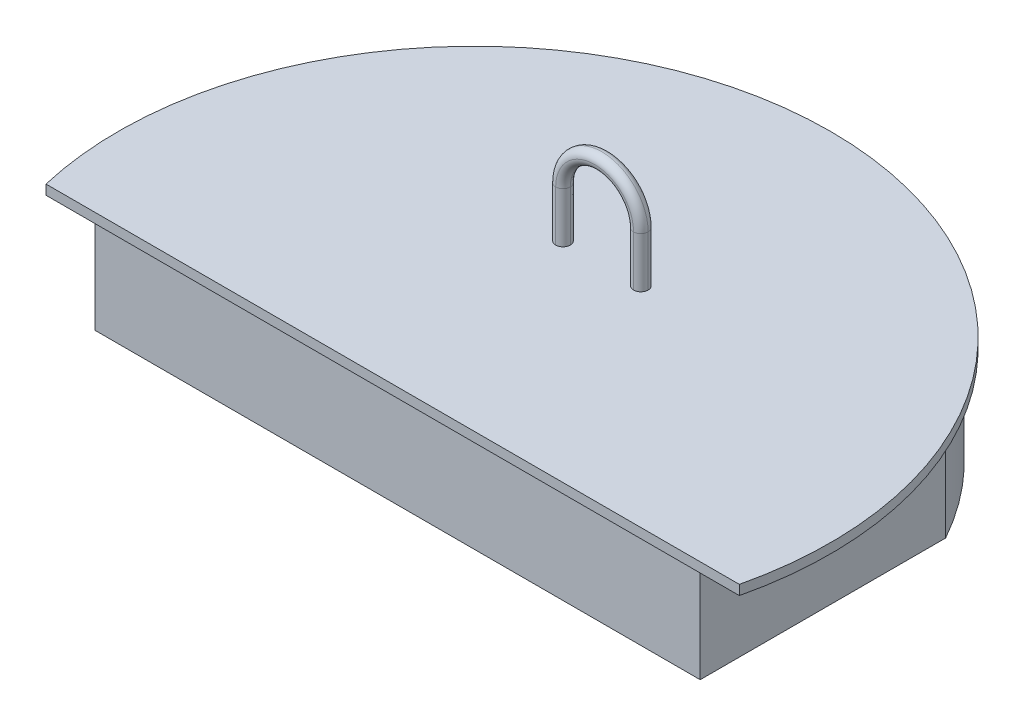
ISO-10303-21;
HEADER;
FILE_DESCRIPTION(('STEP AP214'),'2;1');
FILE_NAME('part.step','',(''),(''),'','','');
FILE_SCHEMA(('AUTOMOTIVE_DESIGN { 1 0 10303 214 1 1 1 1 }'));
ENDSEC;
DATA;
#1=APPLICATION_CONTEXT('core data for automotive mechanical design processes');
#2=APPLICATION_PROTOCOL_DEFINITION('international standard','automotive_design',2000,#1);
#3=PRODUCT_CONTEXT('',#1,'mechanical');
#4=PRODUCT('Part','Part','',(#3));
#5=PRODUCT_RELATED_PRODUCT_CATEGORY('part','',(#4));
#6=PRODUCT_DEFINITION_FORMATION('','',#4);
#7=PRODUCT_DEFINITION_CONTEXT('part definition',#1,'design');
#8=PRODUCT_DEFINITION('design','',#6,#7);
#9=PRODUCT_DEFINITION_SHAPE('','',#8);
#10=(LENGTH_UNIT() NAMED_UNIT(*) SI_UNIT(.MILLI.,.METRE.));
#11=(NAMED_UNIT(*) PLANE_ANGLE_UNIT() SI_UNIT($,.RADIAN.));
#12=(NAMED_UNIT(*) SI_UNIT($,.STERADIAN.) SOLID_ANGLE_UNIT());
#13=UNCERTAINTY_MEASURE_WITH_UNIT(LENGTH_MEASURE(1.E-05),#10,'distance_accuracy_value','');
#14=(GEOMETRIC_REPRESENTATION_CONTEXT(3) GLOBAL_UNCERTAINTY_ASSIGNED_CONTEXT((#13)) GLOBAL_UNIT_ASSIGNED_CONTEXT((#10,
#11,#12)) REPRESENTATION_CONTEXT('',''));
#15=CARTESIAN_POINT('',(0.,0.,0.));
#16=DIRECTION('',(0.,0.,1.));
#17=DIRECTION('',(1.,0.,0.));
#18=AXIS2_PLACEMENT_3D('',#15,#16,#17);
#19=CARTESIAN_POINT('',(0.,22.,0.));
#20=DIRECTION('',(0.,1.,0.));
#21=DIRECTION('',(0.,0.,1.));
#22=AXIS2_PLACEMENT_3D('',#19,#20,#21);
#23=PLANE('',#22);
#24=CARTESIAN_POINT('',(-8.,22.,-26.2));
#25=DIRECTION('',(0.,1.,0.));
#26=DIRECTION('',(0.,0.,1.));
#27=AXIS2_PLACEMENT_3D('',#24,#25,#26);
#28=CIRCLE('',#27,1.5);
#29=CARTESIAN_POINT('',(-8.,22.,-27.7));
#30=VERTEX_POINT('',#29);
#31=CARTESIAN_POINT('',(-6.5,22.,-26.2));
#32=VERTEX_POINT('',#31);
#33=EDGE_CURVE('E71',#30,#32,#28,.F.);
#34=ORIENTED_EDGE('',*,*,#33,.T.);
#35=CARTESIAN_POINT('',(-8.,22.,-26.2));
#36=DIRECTION('',(0.,1.,0.));
#37=DIRECTION('',(0.,0.,1.));
#38=AXIS2_PLACEMENT_3D('',#35,#36,#37);
#39=CIRCLE('',#38,1.5);
#40=CARTESIAN_POINT('',(-8.,22.,-24.7));
#41=VERTEX_POINT('',#40);
#42=EDGE_CURVE('E62',#32,#41,#39,.F.);
#43=ORIENTED_EDGE('',*,*,#42,.T.);
#44=CARTESIAN_POINT('',(-8.,22.,-26.2));
#45=DIRECTION('',(0.,1.,0.));
#46=DIRECTION('',(0.,0.,1.));
#47=AXIS2_PLACEMENT_3D('',#44,#45,#46);
#48=CIRCLE('',#47,1.5);
#49=CARTESIAN_POINT('',(-9.5,22.,-26.2));
#50=VERTEX_POINT('',#49);
#51=EDGE_CURVE('E265',#41,#50,#48,.F.);
#52=ORIENTED_EDGE('',*,*,#51,.T.);
#53=CARTESIAN_POINT('',(-8.,22.,-26.2));
#54=DIRECTION('',(0.,1.,0.));
#55=DIRECTION('',(0.,0.,1.));
#56=AXIS2_PLACEMENT_3D('',#53,#54,#55);
#57=CIRCLE('',#56,1.5);
#58=EDGE_CURVE('E163',#50,#30,#57,.F.);
#59=ORIENTED_EDGE('',*,*,#58,.T.);
#60=EDGE_LOOP('',(#34,#43,#52,#59));
#61=FACE_BOUND('',#60,.T.);
#62=CARTESIAN_POINT('',(8.,22.,-26.2));
#63=DIRECTION('',(0.,1.,0.));
#64=DIRECTION('',(0.,0.,1.));
#65=AXIS2_PLACEMENT_3D('',#62,#63,#64);
#66=CIRCLE('',#65,1.5);
#67=CARTESIAN_POINT('',(9.5,22.,-26.2));
#68=VERTEX_POINT('',#67);
#69=CARTESIAN_POINT('',(8.,22.,-24.7));
#70=VERTEX_POINT('',#69);
#71=EDGE_CURVE('E262',#68,#70,#66,.F.);
#72=ORIENTED_EDGE('',*,*,#71,.T.);
#73=CARTESIAN_POINT('',(8.,22.,-26.2));
#74=DIRECTION('',(0.,1.,0.));
#75=DIRECTION('',(0.,0.,1.));
#76=AXIS2_PLACEMENT_3D('',#73,#74,#75);
#77=CIRCLE('',#76,1.5);
#78=CARTESIAN_POINT('',(6.5,22.,-26.2));
#79=VERTEX_POINT('',#78);
#80=EDGE_CURVE('E13',#70,#79,#77,.F.);
#81=ORIENTED_EDGE('',*,*,#80,.T.);
#82=CARTESIAN_POINT('',(8.,22.,-26.2));
#83=DIRECTION('',(0.,1.,0.));
#84=DIRECTION('',(0.,0.,1.));
#85=AXIS2_PLACEMENT_3D('',#82,#83,#84);
#86=CIRCLE('',#85,1.5);
#87=CARTESIAN_POINT('',(8.,22.,-27.7));
#88=VERTEX_POINT('',#87);
#89=EDGE_CURVE('E270',#79,#88,#86,.F.);
#90=ORIENTED_EDGE('',*,*,#89,.T.);
#91=CARTESIAN_POINT('',(8.,22.,-26.2));
#92=DIRECTION('',(0.,1.,0.));
#93=DIRECTION('',(0.,0.,1.));
#94=AXIS2_PLACEMENT_3D('',#91,#92,#93);
#95=CIRCLE('',#94,1.5);
#96=EDGE_CURVE('E268',#88,#68,#95,.F.);
#97=ORIENTED_EDGE('',*,*,#96,.T.);
#98=EDGE_LOOP('',(#72,#81,#90,#97));
#99=FACE_BOUND('',#98,.T.);
#100=CARTESIAN_POINT('',(0.,22.,0.));
#101=DIRECTION('',(0.,1.,0.));
#102=DIRECTION('',(0.,0.,1.));
#103=AXIS2_PLACEMENT_3D('',#100,#101,#102);
#104=CIRCLE('',#103,73.2);
#105=CARTESIAN_POINT('',(71.2460525222275,22.,16.8));
#106=VERTEX_POINT('',#105);
#107=CARTESIAN_POINT('',(-71.2460525222275,22.,16.8));
#108=VERTEX_POINT('',#107);
#109=EDGE_CURVE('E226',#106,#108,#104,.T.);
#110=ORIENTED_EDGE('',*,*,#109,.T.);
#111=DIRECTION('',(1.,0.,0.));
#112=VECTOR('',#111,1.);
#113=CARTESIAN_POINT('',(0.,22.,16.8));
#114=LINE('',#113,#112);
#115=EDGE_CURVE('E243',#108,#106,#114,.T.);
#116=ORIENTED_EDGE('',*,*,#115,.T.);
#117=EDGE_LOOP('',(#110,#116));
#118=FACE_BOUND('',#117,.T.);
#119=ADVANCED_FACE('F52',(#61,#99,#118),#23,.T.);
#120=CARTESIAN_POINT('',(0.,20.,0.));
#121=DIRECTION('',(0.,1.,0.));
#122=DIRECTION('',(0.,0.,1.));
#123=AXIS2_PLACEMENT_3D('',#120,#121,#122);
#124=PLANE('',#123);
#125=CARTESIAN_POINT('',(-8.,20.,-26.2));
#126=DIRECTION('',(0.,1.,0.));
#127=DIRECTION('',(0.,0.,1.));
#128=AXIS2_PLACEMENT_3D('',#125,#126,#127);
#129=CIRCLE('',#128,1.5);
#130=CARTESIAN_POINT('',(-8.,20.,-27.7));
#131=VERTEX_POINT('',#130);
#132=CARTESIAN_POINT('',(-9.5,20.,-26.2));
#133=VERTEX_POINT('',#132);
#134=EDGE_CURVE('E247',#131,#133,#129,.T.);
#135=ORIENTED_EDGE('',*,*,#134,.T.);
#136=CARTESIAN_POINT('',(-8.,20.,-26.2));
#137=DIRECTION('',(0.,1.,0.));
#138=DIRECTION('',(0.,0.,1.));
#139=AXIS2_PLACEMENT_3D('',#136,#137,#138);
#140=CIRCLE('',#139,1.5);
#141=CARTESIAN_POINT('',(-8.,20.,-24.7));
#142=VERTEX_POINT('',#141);
#143=EDGE_CURVE('E258',#133,#142,#140,.T.);
#144=ORIENTED_EDGE('',*,*,#143,.T.);
#145=CARTESIAN_POINT('',(-8.,20.,-26.2));
#146=DIRECTION('',(0.,1.,0.));
#147=DIRECTION('',(0.,0.,1.));
#148=AXIS2_PLACEMENT_3D('',#145,#146,#147);
#149=CIRCLE('',#148,1.5);
#150=CARTESIAN_POINT('',(-6.5,20.,-26.2));
#151=VERTEX_POINT('',#150);
#152=EDGE_CURVE('E256',#142,#151,#149,.T.);
#153=ORIENTED_EDGE('',*,*,#152,.T.);
#154=CARTESIAN_POINT('',(-8.,20.,-26.2));
#155=DIRECTION('',(0.,1.,0.));
#156=DIRECTION('',(0.,0.,1.));
#157=AXIS2_PLACEMENT_3D('',#154,#155,#156);
#158=CIRCLE('',#157,1.5);
#159=EDGE_CURVE('E250',#151,#131,#158,.T.);
#160=ORIENTED_EDGE('',*,*,#159,.T.);
#161=EDGE_LOOP('',(#135,#144,#153,#160));
#162=FACE_BOUND('',#161,.T.);
#163=CARTESIAN_POINT('',(8.,20.,-26.2));
#164=DIRECTION('',(0.,1.,0.));
#165=DIRECTION('',(0.,0.,1.));
#166=AXIS2_PLACEMENT_3D('',#163,#164,#165);
#167=CIRCLE('',#166,1.5);
#168=CARTESIAN_POINT('',(6.5,20.,-26.2));
#169=VERTEX_POINT('',#168);
#170=CARTESIAN_POINT('',(8.,20.,-24.7));
#171=VERTEX_POINT('',#170);
#172=EDGE_CURVE('E254',#169,#171,#167,.T.);
#173=ORIENTED_EDGE('',*,*,#172,.T.);
#174=CARTESIAN_POINT('',(8.,20.,-26.2));
#175=DIRECTION('',(0.,1.,0.));
#176=DIRECTION('',(0.,0.,1.));
#177=AXIS2_PLACEMENT_3D('',#174,#175,#176);
#178=CIRCLE('',#177,1.5);
#179=CARTESIAN_POINT('',(9.5,20.,-26.2));
#180=VERTEX_POINT('',#179);
#181=EDGE_CURVE('E260',#171,#180,#178,.T.);
#182=ORIENTED_EDGE('',*,*,#181,.T.);
#183=CARTESIAN_POINT('',(8.,20.,-26.2));
#184=DIRECTION('',(0.,1.,0.));
#185=DIRECTION('',(0.,0.,1.));
#186=AXIS2_PLACEMENT_3D('',#183,#184,#185);
#187=CIRCLE('',#186,1.5);
#188=CARTESIAN_POINT('',(8.,20.,-27.7));
#189=VERTEX_POINT('',#188);
#190=EDGE_CURVE('E252',#180,#189,#187,.T.);
#191=ORIENTED_EDGE('',*,*,#190,.T.);
#192=CARTESIAN_POINT('',(8.,20.,-26.2));
#193=DIRECTION('',(0.,1.,0.));
#194=DIRECTION('',(0.,0.,1.));
#195=AXIS2_PLACEMENT_3D('',#192,#193,#194);
#196=CIRCLE('',#195,1.5);
#197=EDGE_CURVE('E225',#189,#169,#196,.T.);
#198=ORIENTED_EDGE('',*,*,#197,.T.);
#199=EDGE_LOOP('',(#173,#182,#191,#198));
#200=FACE_BOUND('',#199,.T.);
#201=DIRECTION('',(1.,0.,0.));
#202=VECTOR('',#201,1.);
#203=CARTESIAN_POINT('',(0.,20.,16.8));
#204=LINE('',#203,#202);
#205=CARTESIAN_POINT('',(-71.2460525222275,20.,16.8));
#206=VERTEX_POINT('',#205);
#207=CARTESIAN_POINT('',(71.2460525222275,20.,16.8));
#208=VERTEX_POINT('',#207);
#209=EDGE_CURVE('E221',#206,#208,#204,.T.);
#210=ORIENTED_EDGE('',*,*,#209,.F.);
#211=CARTESIAN_POINT('',(0.,20.,0.));
#212=DIRECTION('',(0.,1.,0.));
#213=DIRECTION('',(0.,0.,1.));
#214=AXIS2_PLACEMENT_3D('',#211,#212,#213);
#215=CIRCLE('',#214,73.2);
#216=EDGE_CURVE('E217',#208,#206,#215,.T.);
#217=ORIENTED_EDGE('',*,*,#216,.F.);
#218=EDGE_LOOP('',(#210,#217));
#219=FACE_BOUND('',#218,.T.);
#220=ADVANCED_FACE('F219',(#162,#200,#219),#124,.F.);
#221=CARTESIAN_POINT('',(0.,0.,16.8));
#222=DIRECTION('',(0.,0.,1.));
#223=DIRECTION('',(1.,0.,0.));
#224=AXIS2_PLACEMENT_3D('',#221,#222,#223);
#225=PLANE('',#224);
#226=ORIENTED_EDGE('',*,*,#115,.F.);
#227=DIRECTION('',(0.,-1.,0.));
#228=VECTOR('',#227,1.);
#229=CARTESIAN_POINT('',(-71.2460525222275,22.,16.8));
#230=LINE('',#229,#228);
#231=EDGE_CURVE('E234',#108,#206,#230,.T.);
#232=ORIENTED_EDGE('',*,*,#231,.T.);
#233=ORIENTED_EDGE('',*,*,#209,.T.);
#234=DIRECTION('',(0.,-1.,0.));
#235=VECTOR('',#234,1.);
#236=CARTESIAN_POINT('',(71.2460525222275,22.,16.8));
#237=LINE('',#236,#235);
#238=EDGE_CURVE('E230',#208,#106,#237,.F.);
#239=ORIENTED_EDGE('',*,*,#238,.T.);
#240=EDGE_LOOP('',(#226,#232,#233,#239));
#241=FACE_BOUND('',#240,.T.);
#242=ADVANCED_FACE('F236',(#241),#225,.T.);
#243=CARTESIAN_POINT('',(0.,22.,0.));
#244=DIRECTION('',(0.,-1.,0.));
#245=DIRECTION('',(0.,0.,-1.));
#246=AXIS2_PLACEMENT_3D('',#243,#244,#245);
#247=CYLINDRICAL_SURFACE('',#246,73.2);
#248=ORIENTED_EDGE('',*,*,#231,.F.);
#249=ORIENTED_EDGE('',*,*,#109,.F.);
#250=ORIENTED_EDGE('',*,*,#238,.F.);
#251=ORIENTED_EDGE('',*,*,#216,.T.);
#252=EDGE_LOOP('',(#248,#249,#250,#251));
#253=FACE_BOUND('',#252,.T.);
#254=ADVANCED_FACE('F231',(#253),#247,.T.);
#255=CARTESIAN_POINT('',(-8.,0.,-26.2));
#256=DIRECTION('',(0.,-1.,0.));
#257=DIRECTION('',(0.,0.,-1.));
#258=AXIS2_PLACEMENT_3D('',#255,#256,#257);
#259=CYLINDRICAL_SURFACE('',#258,1.5);
#260=DIRECTION('',(0.,1.,0.));
#261=VECTOR('',#260,1.);
#262=CARTESIAN_POINT('',(-8.,9.64110295611096,-24.7));
#263=LINE('',#262,#261);
#264=CARTESIAN_POINT('',(-8.,9.64110295611096,-24.7));
#265=VERTEX_POINT('',#264);
#266=EDGE_CURVE('E237',#142,#265,#263,.F.);
#267=ORIENTED_EDGE('',*,*,#266,.F.);
#268=ORIENTED_EDGE('',*,*,#143,.F.);
#269=DIRECTION('',(0.,1.,0.));
#270=VECTOR('',#269,1.);
#271=CARTESIAN_POINT('',(-9.5,20.,-26.2));
#272=LINE('',#271,#270);
#273=CARTESIAN_POINT('',(-9.5,9.64110295611096,-26.2));
#274=VERTEX_POINT('',#273);
#275=EDGE_CURVE('E239',#274,#133,#272,.T.);
#276=ORIENTED_EDGE('',*,*,#275,.F.);
#277=CARTESIAN_POINT('',(-8.,9.64110295611096,-26.2));
#278=DIRECTION('',(0.,-1.,0.));
#279=DIRECTION('',(0.,0.,-1.));
#280=AXIS2_PLACEMENT_3D('',#277,#278,#279);
#281=CIRCLE('',#280,1.5);
#282=EDGE_CURVE('E321',#265,#274,#281,.T.);
#283=ORIENTED_EDGE('',*,*,#282,.F.);
#284=EDGE_LOOP('',(#267,#268,#276,#283));
#285=FACE_BOUND('',#284,.T.);
#286=ADVANCED_FACE('F434',(#285),#259,.T.);
#287=CARTESIAN_POINT('',(-8.,0.,-26.2));
#288=DIRECTION('',(0.,1.,0.));
#289=DIRECTION('',(0.,0.,1.));
#290=AXIS2_PLACEMENT_3D('',#287,#288,#289);
#291=CYLINDRICAL_SURFACE('',#290,1.5);
#292=ORIENTED_EDGE('',*,*,#152,.F.);
#293=ORIENTED_EDGE('',*,*,#266,.T.);
#294=CARTESIAN_POINT('',(-8.,9.64110295611096,-26.2));
#295=DIRECTION('',(0.,-1.,0.));
#296=DIRECTION('',(0.,0.,-1.));
#297=AXIS2_PLACEMENT_3D('',#294,#295,#296);
#298=CIRCLE('',#297,1.5);
#299=CARTESIAN_POINT('',(-6.5,9.64110295611096,-26.2));
#300=VERTEX_POINT('',#299);
#301=EDGE_CURVE('E313',#300,#265,#298,.T.);
#302=ORIENTED_EDGE('',*,*,#301,.F.);
#303=DIRECTION('',(0.,1.,0.));
#304=VECTOR('',#303,1.);
#305=CARTESIAN_POINT('',(-6.5,0.,-26.2));
#306=LINE('',#305,#304);
#307=EDGE_CURVE('E310',#151,#300,#306,.F.);
#308=ORIENTED_EDGE('',*,*,#307,.F.);
#309=EDGE_LOOP('',(#292,#293,#302,#308));
#310=FACE_BOUND('',#309,.T.);
#311=ADVANCED_FACE('F430',(#310),#291,.T.);
#312=CARTESIAN_POINT('',(-8.,0.,-26.2));
#313=DIRECTION('',(0.,1.,0.));
#314=DIRECTION('',(0.,0.,1.));
#315=AXIS2_PLACEMENT_3D('',#312,#313,#314);
#316=CYLINDRICAL_SURFACE('',#315,1.5);
#317=ORIENTED_EDGE('',*,*,#275,.T.);
#318=ORIENTED_EDGE('',*,*,#134,.F.);
#319=DIRECTION('',(0.,1.,0.));
#320=VECTOR('',#319,1.);
#321=CARTESIAN_POINT('',(-8.,0.,-27.7));
#322=LINE('',#321,#320);
#323=CARTESIAN_POINT('',(-8.,9.64110295611096,-27.7));
#324=VERTEX_POINT('',#323);
#325=EDGE_CURVE('E307',#324,#131,#322,.T.);
#326=ORIENTED_EDGE('',*,*,#325,.F.);
#327=CARTESIAN_POINT('',(-8.,9.64110295611096,-26.2));
#328=DIRECTION('',(0.,-1.,0.));
#329=DIRECTION('',(0.,0.,-1.));
#330=AXIS2_PLACEMENT_3D('',#327,#328,#329);
#331=CIRCLE('',#330,1.5);
#332=EDGE_CURVE('E304',#274,#324,#331,.T.);
#333=ORIENTED_EDGE('',*,*,#332,.F.);
#334=EDGE_LOOP('',(#317,#318,#326,#333));
#335=FACE_BOUND('',#334,.T.);
#336=ADVANCED_FACE('F426',(#335),#316,.T.);
#337=CARTESIAN_POINT('',(0.,9.64110295611096,-26.2));
#338=DIRECTION('',(0.,0.,-1.));
#339=DIRECTION('',(-1.,0.,0.));
#340=AXIS2_PLACEMENT_3D('',#337,#338,#339);
#341=TOROIDAL_SURFACE('',#340,8.,1.5);
#342=CARTESIAN_POINT('',(8.,9.64110295611096,-26.2));
#343=DIRECTION('',(0.,1.,0.));
#344=DIRECTION('',(0.,0.,1.));
#345=AXIS2_PLACEMENT_3D('',#342,#343,#344);
#346=CIRCLE('',#345,1.5);
#347=CARTESIAN_POINT('',(8.,9.64110295611096,-24.7));
#348=VERTEX_POINT('',#347);
#349=CARTESIAN_POINT('',(9.5,9.64110295611096,-26.2));
#350=VERTEX_POINT('',#349);
#351=EDGE_CURVE('E319',#348,#350,#346,.T.);
#352=ORIENTED_EDGE('',*,*,#351,.F.);
#353=CARTESIAN_POINT('',(0.,9.64110295611096,-24.7));
#354=DIRECTION('',(0.,0.,-1.));
#355=DIRECTION('',(-1.,0.,0.));
#356=AXIS2_PLACEMENT_3D('',#353,#354,#355);
#357=CIRCLE('',#356,8.);
#358=EDGE_CURVE('E316',#265,#348,#357,.F.);
#359=ORIENTED_EDGE('',*,*,#358,.F.);
#360=ORIENTED_EDGE('',*,*,#282,.T.);
#361=CARTESIAN_POINT('',(0.,9.64110295611096,-26.2));
#362=DIRECTION('',(0.,0.,-1.));
#363=DIRECTION('',(-1.,0.,0.));
#364=AXIS2_PLACEMENT_3D('',#361,#362,#363);
#365=CIRCLE('',#364,9.5);
#366=EDGE_CURVE('E301',#350,#274,#365,.T.);
#367=ORIENTED_EDGE('',*,*,#366,.F.);
#368=EDGE_LOOP('',(#352,#359,#360,#367));
#369=FACE_BOUND('',#368,.T.);
#370=ADVANCED_FACE('F422',(#369),#341,.T.);
#371=CARTESIAN_POINT('',(8.,0.,-26.2));
#372=DIRECTION('',(0.,1.,0.));
#373=DIRECTION('',(0.,0.,1.));
#374=AXIS2_PLACEMENT_3D('',#371,#372,#373);
#375=CYLINDRICAL_SURFACE('',#374,1.5);
#376=DIRECTION('',(0.,-1.,0.));
#377=VECTOR('',#376,1.);
#378=CARTESIAN_POINT('',(8.,20.,-24.7));
#379=LINE('',#378,#377);
#380=EDGE_CURVE('E293',#348,#171,#379,.F.);
#381=ORIENTED_EDGE('',*,*,#380,.F.);
#382=ORIENTED_EDGE('',*,*,#351,.T.);
#383=DIRECTION('',(0.,-1.,0.));
#384=VECTOR('',#383,1.);
#385=CARTESIAN_POINT('',(9.5,9.64110295611096,-26.2));
#386=LINE('',#385,#384);
#387=EDGE_CURVE('E296',#180,#350,#386,.T.);
#388=ORIENTED_EDGE('',*,*,#387,.F.);
#389=ORIENTED_EDGE('',*,*,#181,.F.);
#390=EDGE_LOOP('',(#381,#382,#388,#389));
#391=FACE_BOUND('',#390,.T.);
#392=ADVANCED_FACE('F418',(#391),#375,.T.);
#393=CARTESIAN_POINT('',(0.,9.64110295611096,-26.2));
#394=DIRECTION('',(0.,0.,-1.));
#395=DIRECTION('',(-1.,0.,0.));
#396=AXIS2_PLACEMENT_3D('',#393,#394,#395);
#397=TOROIDAL_SURFACE('',#396,8.,1.5);
#398=ORIENTED_EDGE('',*,*,#301,.T.);
#399=ORIENTED_EDGE('',*,*,#358,.T.);
#400=CARTESIAN_POINT('',(8.,9.64110295611096,-26.2));
#401=DIRECTION('',(0.,1.,0.));
#402=DIRECTION('',(0.,0.,1.));
#403=AXIS2_PLACEMENT_3D('',#400,#401,#402);
#404=CIRCLE('',#403,1.5);
#405=CARTESIAN_POINT('',(6.5,9.64110295611096,-26.2));
#406=VERTEX_POINT('',#405);
#407=EDGE_CURVE('E290',#406,#348,#404,.T.);
#408=ORIENTED_EDGE('',*,*,#407,.F.);
#409=CARTESIAN_POINT('',(0.,9.64110295611096,-26.2));
#410=DIRECTION('',(0.,0.,-1.));
#411=DIRECTION('',(-1.,0.,0.));
#412=AXIS2_PLACEMENT_3D('',#409,#410,#411);
#413=CIRCLE('',#412,6.5);
#414=EDGE_CURVE('E287',#300,#406,#413,.F.);
#415=ORIENTED_EDGE('',*,*,#414,.F.);
#416=EDGE_LOOP('',(#398,#399,#408,#415));
#417=FACE_BOUND('',#416,.T.);
#418=ADVANCED_FACE('F414',(#417),#397,.T.);
#419=CARTESIAN_POINT('',(-8.,0.,-26.2));
#420=DIRECTION('',(0.,-1.,0.));
#421=DIRECTION('',(0.,0.,-1.));
#422=AXIS2_PLACEMENT_3D('',#419,#420,#421);
#423=CYLINDRICAL_SURFACE('',#422,1.5);
#424=ORIENTED_EDGE('',*,*,#159,.F.);
#425=ORIENTED_EDGE('',*,*,#307,.T.);
#426=CARTESIAN_POINT('',(-8.,9.64110295611096,-26.2));
#427=DIRECTION('',(0.,-1.,0.));
#428=DIRECTION('',(0.,0.,-1.));
#429=AXIS2_PLACEMENT_3D('',#426,#427,#428);
#430=CIRCLE('',#429,1.5);
#431=EDGE_CURVE('E284',#324,#300,#430,.T.);
#432=ORIENTED_EDGE('',*,*,#431,.F.);
#433=ORIENTED_EDGE('',*,*,#325,.T.);
#434=EDGE_LOOP('',(#424,#425,#432,#433));
#435=FACE_BOUND('',#434,.T.);
#436=ADVANCED_FACE('F410',(#435),#423,.T.);
#437=CARTESIAN_POINT('',(0.,9.64110295611096,-26.2));
#438=DIRECTION('',(0.,0.,-1.));
#439=DIRECTION('',(-1.,0.,0.));
#440=AXIS2_PLACEMENT_3D('',#437,#438,#439);
#441=TOROIDAL_SURFACE('',#440,8.,1.5);
#442=CARTESIAN_POINT('',(8.,9.64110295611096,-26.2));
#443=DIRECTION('',(0.,1.,0.));
#444=DIRECTION('',(0.,0.,1.));
#445=AXIS2_PLACEMENT_3D('',#442,#443,#444);
#446=CIRCLE('',#445,1.5);
#447=CARTESIAN_POINT('',(8.,9.64110295611096,-27.7));
#448=VERTEX_POINT('',#447);
#449=EDGE_CURVE('E299',#350,#448,#446,.T.);
#450=ORIENTED_EDGE('',*,*,#449,.F.);
#451=ORIENTED_EDGE('',*,*,#366,.T.);
#452=ORIENTED_EDGE('',*,*,#332,.T.);
#453=CARTESIAN_POINT('',(0.,9.64110295611096,-27.7));
#454=DIRECTION('',(0.,0.,-1.));
#455=DIRECTION('',(-1.,0.,0.));
#456=AXIS2_PLACEMENT_3D('',#453,#454,#455);
#457=CIRCLE('',#456,8.);
#458=EDGE_CURVE('E281',#448,#324,#457,.T.);
#459=ORIENTED_EDGE('',*,*,#458,.F.);
#460=EDGE_LOOP('',(#450,#451,#452,#459));
#461=FACE_BOUND('',#460,.T.);
#462=ADVANCED_FACE('F406',(#461),#441,.T.);
#463=CARTESIAN_POINT('',(8.,0.,-26.2));
#464=DIRECTION('',(0.,-1.,0.));
#465=DIRECTION('',(0.,0.,-1.));
#466=AXIS2_PLACEMENT_3D('',#463,#464,#465);
#467=CYLINDRICAL_SURFACE('',#466,1.5);
#468=ORIENTED_EDGE('',*,*,#387,.T.);
#469=ORIENTED_EDGE('',*,*,#449,.T.);
#470=DIRECTION('',(0.,-1.,0.));
#471=VECTOR('',#470,1.);
#472=CARTESIAN_POINT('',(8.,0.,-27.7));
#473=LINE('',#472,#471);
#474=EDGE_CURVE('E278',#189,#448,#473,.T.);
#475=ORIENTED_EDGE('',*,*,#474,.F.);
#476=ORIENTED_EDGE('',*,*,#190,.F.);
#477=EDGE_LOOP('',(#468,#469,#475,#476));
#478=FACE_BOUND('',#477,.T.);
#479=ADVANCED_FACE('F402',(#478),#467,.T.);
#480=CARTESIAN_POINT('',(8.,0.,-26.2));
#481=DIRECTION('',(0.,-1.,0.));
#482=DIRECTION('',(0.,0.,-1.));
#483=AXIS2_PLACEMENT_3D('',#480,#481,#482);
#484=CYLINDRICAL_SURFACE('',#483,1.5);
#485=ORIENTED_EDGE('',*,*,#380,.T.);
#486=ORIENTED_EDGE('',*,*,#172,.F.);
#487=DIRECTION('',(0.,-1.,0.));
#488=VECTOR('',#487,1.);
#489=CARTESIAN_POINT('',(6.5,0.,-26.2));
#490=LINE('',#489,#488);
#491=EDGE_CURVE('E276',#406,#169,#490,.F.);
#492=ORIENTED_EDGE('',*,*,#491,.F.);
#493=ORIENTED_EDGE('',*,*,#407,.T.);
#494=EDGE_LOOP('',(#485,#486,#492,#493));
#495=FACE_BOUND('',#494,.T.);
#496=ADVANCED_FACE('F398',(#495),#484,.T.);
#497=CARTESIAN_POINT('',(0.,9.64110295611096,-26.2));
#498=DIRECTION('',(0.,0.,-1.));
#499=DIRECTION('',(-1.,0.,0.));
#500=AXIS2_PLACEMENT_3D('',#497,#498,#499);
#501=TOROIDAL_SURFACE('',#500,8.,1.5);
#502=ORIENTED_EDGE('',*,*,#431,.T.);
#503=ORIENTED_EDGE('',*,*,#414,.T.);
#504=CARTESIAN_POINT('',(8.,9.64110295611096,-26.2));
#505=DIRECTION('',(0.,1.,0.));
#506=DIRECTION('',(0.,0.,1.));
#507=AXIS2_PLACEMENT_3D('',#504,#505,#506);
#508=CIRCLE('',#507,1.5);
#509=EDGE_CURVE('E134',#448,#406,#508,.T.);
#510=ORIENTED_EDGE('',*,*,#509,.F.);
#511=ORIENTED_EDGE('',*,*,#458,.T.);
#512=EDGE_LOOP('',(#502,#503,#510,#511));
#513=FACE_BOUND('',#512,.T.);
#514=ADVANCED_FACE('F394',(#513),#501,.T.);
#515=CARTESIAN_POINT('',(8.,0.,-26.2));
#516=DIRECTION('',(0.,1.,0.));
#517=DIRECTION('',(0.,0.,1.));
#518=AXIS2_PLACEMENT_3D('',#515,#516,#517);
#519=CYLINDRICAL_SURFACE('',#518,1.5);
#520=ORIENTED_EDGE('',*,*,#197,.F.);
#521=ORIENTED_EDGE('',*,*,#474,.T.);
#522=ORIENTED_EDGE('',*,*,#509,.T.);
#523=ORIENTED_EDGE('',*,*,#491,.T.);
#524=EDGE_LOOP('',(#520,#521,#522,#523));
#525=FACE_BOUND('',#524,.T.);
#526=ADVANCED_FACE('F391',(#525),#519,.T.);
#527=CARTESIAN_POINT('',(-8.,0.,-26.2));
#528=DIRECTION('',(0.,-1.,0.));
#529=DIRECTION('',(0.,0.,-1.));
#530=AXIS2_PLACEMENT_3D('',#527,#528,#529);
#531=CYLINDRICAL_SURFACE('',#530,1.5);
#532=DIRECTION('',(0.,1.,0.));
#533=VECTOR('',#532,1.);
#534=CARTESIAN_POINT('',(-6.5,32.358897043889,-26.2));
#535=LINE('',#534,#533);
#536=CARTESIAN_POINT('',(-6.5,32.358897043889,-26.2));
#537=VERTEX_POINT('',#536);
#538=EDGE_CURVE('E56',#32,#537,#535,.T.);
#539=ORIENTED_EDGE('',*,*,#538,.F.);
#540=ORIENTED_EDGE('',*,*,#33,.F.);
#541=DIRECTION('',(0.,1.,0.));
#542=VECTOR('',#541,1.);
#543=CARTESIAN_POINT('',(-8.,22.,-27.7));
#544=LINE('',#543,#542);
#545=CARTESIAN_POINT('',(-8.,32.358897043889,-27.7));
#546=VERTEX_POINT('',#545);
#547=EDGE_CURVE('E124',#546,#30,#544,.F.);
#548=ORIENTED_EDGE('',*,*,#547,.F.);
#549=CARTESIAN_POINT('',(-8.,32.358897043889,-26.2));
#550=DIRECTION('',(0.,1.,0.));
#551=DIRECTION('',(0.,0.,1.));
#552=AXIS2_PLACEMENT_3D('',#549,#550,#551);
#553=CIRCLE('',#552,1.5);
#554=EDGE_CURVE('E135',#537,#546,#553,.T.);
#555=ORIENTED_EDGE('',*,*,#554,.F.);
#556=EDGE_LOOP('',(#539,#540,#548,#555));
#557=FACE_BOUND('',#556,.T.);
#558=ADVANCED_FACE('F54',(#557),#531,.T.);
#559=CARTESIAN_POINT('',(-8.,0.,-26.2));
#560=DIRECTION('',(0.,1.,0.));
#561=DIRECTION('',(0.,0.,1.));
#562=AXIS2_PLACEMENT_3D('',#559,#560,#561);
#563=CYLINDRICAL_SURFACE('',#562,1.5);
#564=ORIENTED_EDGE('',*,*,#42,.F.);
#565=ORIENTED_EDGE('',*,*,#538,.T.);
#566=CARTESIAN_POINT('',(-8.,32.358897043889,-26.2));
#567=DIRECTION('',(0.,1.,0.));
#568=DIRECTION('',(0.,0.,1.));
#569=AXIS2_PLACEMENT_3D('',#566,#567,#568);
#570=CIRCLE('',#569,1.5);
#571=CARTESIAN_POINT('',(-8.,32.358897043889,-24.7));
#572=VERTEX_POINT('',#571);
#573=EDGE_CURVE('E132',#572,#537,#570,.T.);
#574=ORIENTED_EDGE('',*,*,#573,.F.);
#575=DIRECTION('',(0.,1.,0.));
#576=VECTOR('',#575,1.);
#577=CARTESIAN_POINT('',(-8.,0.,-24.7));
#578=LINE('',#577,#576);
#579=EDGE_CURVE('E153',#41,#572,#578,.T.);
#580=ORIENTED_EDGE('',*,*,#579,.F.);
#581=EDGE_LOOP('',(#564,#565,#574,#580));
#582=FACE_BOUND('',#581,.T.);
#583=ADVANCED_FACE('F129',(#582),#563,.T.);
#584=CARTESIAN_POINT('',(-8.,0.,-26.2));
#585=DIRECTION('',(0.,1.,0.));
#586=DIRECTION('',(0.,0.,1.));
#587=AXIS2_PLACEMENT_3D('',#584,#585,#586);
#588=CYLINDRICAL_SURFACE('',#587,1.5);
#589=ORIENTED_EDGE('',*,*,#547,.T.);
#590=ORIENTED_EDGE('',*,*,#58,.F.);
#591=DIRECTION('',(0.,1.,0.));
#592=VECTOR('',#591,1.);
#593=CARTESIAN_POINT('',(-9.5,0.,-26.2));
#594=LINE('',#593,#592);
#595=CARTESIAN_POINT('',(-9.5,32.358897043889,-26.2));
#596=VERTEX_POINT('',#595);
#597=EDGE_CURVE('E155',#596,#50,#594,.F.);
#598=ORIENTED_EDGE('',*,*,#597,.F.);
#599=CARTESIAN_POINT('',(-8.,32.358897043889,-26.2));
#600=DIRECTION('',(0.,1.,0.));
#601=DIRECTION('',(0.,0.,1.));
#602=AXIS2_PLACEMENT_3D('',#599,#600,#601);
#603=CIRCLE('',#602,1.5);
#604=EDGE_CURVE('E166',#546,#596,#603,.T.);
#605=ORIENTED_EDGE('',*,*,#604,.F.);
#606=EDGE_LOOP('',(#589,#590,#598,#605));
#607=FACE_BOUND('',#606,.T.);
#608=ADVANCED_FACE('F161',(#607),#588,.T.);
#609=CARTESIAN_POINT('',(0.,32.358897043889,-26.2));
#610=DIRECTION('',(0.,0.,-1.));
#611=DIRECTION('',(-1.,0.,0.));
#612=AXIS2_PLACEMENT_3D('',#609,#610,#611);
#613=TOROIDAL_SURFACE('',#612,8.,1.5);
#614=CARTESIAN_POINT('',(0.,32.358897043889,-26.2));
#615=DIRECTION('',(0.,0.,-1.));
#616=DIRECTION('',(-1.,0.,0.));
#617=AXIS2_PLACEMENT_3D('',#614,#615,#616);
#618=CIRCLE('',#617,6.5);
#619=CARTESIAN_POINT('',(6.5,32.358897043889,-26.2));
#620=VERTEX_POINT('',#619);
#621=EDGE_CURVE('E139',#537,#620,#618,.T.);
#622=ORIENTED_EDGE('',*,*,#621,.F.);
#623=ORIENTED_EDGE('',*,*,#554,.T.);
#624=CARTESIAN_POINT('',(0.,32.358897043889,-27.7));
#625=DIRECTION('',(0.,0.,-1.));
#626=DIRECTION('',(-1.,0.,0.));
#627=AXIS2_PLACEMENT_3D('',#624,#625,#626);
#628=CIRCLE('',#627,8.);
#629=CARTESIAN_POINT('',(8.,32.358897043889,-27.7));
#630=VERTEX_POINT('',#629);
#631=EDGE_CURVE('E352',#630,#546,#628,.F.);
#632=ORIENTED_EDGE('',*,*,#631,.F.);
#633=CARTESIAN_POINT('',(8.,32.358897043889,-26.2));
#634=DIRECTION('',(0.,-1.,0.));
#635=DIRECTION('',(0.,0.,-1.));
#636=AXIS2_PLACEMENT_3D('',#633,#634,#635);
#637=CIRCLE('',#636,1.5);
#638=EDGE_CURVE('E144',#620,#630,#637,.T.);
#639=ORIENTED_EDGE('',*,*,#638,.F.);
#640=EDGE_LOOP('',(#622,#623,#632,#639));
#641=FACE_BOUND('',#640,.T.);
#642=ADVANCED_FACE('F142',(#641),#613,.T.);
#643=CARTESIAN_POINT('',(0.,32.358897043889,-26.2));
#644=DIRECTION('',(0.,0.,-1.));
#645=DIRECTION('',(-1.,0.,0.));
#646=AXIS2_PLACEMENT_3D('',#643,#644,#645);
#647=TOROIDAL_SURFACE('',#646,8.,1.5);
#648=ORIENTED_EDGE('',*,*,#573,.T.);
#649=ORIENTED_EDGE('',*,*,#621,.T.);
#650=CARTESIAN_POINT('',(8.,32.358897043889,-26.2));
#651=DIRECTION('',(0.,-1.,0.));
#652=DIRECTION('',(0.,0.,-1.));
#653=AXIS2_PLACEMENT_3D('',#650,#651,#652);
#654=CIRCLE('',#653,1.5);
#655=CARTESIAN_POINT('',(8.,32.358897043889,-24.7));
#656=VERTEX_POINT('',#655);
#657=EDGE_CURVE('E345',#656,#620,#654,.T.);
#658=ORIENTED_EDGE('',*,*,#657,.F.);
#659=CARTESIAN_POINT('',(0.,32.358897043889,-24.7));
#660=DIRECTION('',(0.,0.,-1.));
#661=DIRECTION('',(-1.,0.,0.));
#662=AXIS2_PLACEMENT_3D('',#659,#660,#661);
#663=CIRCLE('',#662,8.);
#664=EDGE_CURVE('E151',#572,#656,#663,.T.);
#665=ORIENTED_EDGE('',*,*,#664,.F.);
#666=EDGE_LOOP('',(#648,#649,#658,#665));
#667=FACE_BOUND('',#666,.T.);
#668=ADVANCED_FACE('F149',(#667),#647,.T.);
#669=CARTESIAN_POINT('',(-8.,0.,-26.2));
#670=DIRECTION('',(0.,-1.,0.));
#671=DIRECTION('',(0.,0.,-1.));
#672=AXIS2_PLACEMENT_3D('',#669,#670,#671);
#673=CYLINDRICAL_SURFACE('',#672,1.5);
#674=ORIENTED_EDGE('',*,*,#51,.F.);
#675=ORIENTED_EDGE('',*,*,#579,.T.);
#676=CARTESIAN_POINT('',(-8.,32.358897043889,-26.2));
#677=DIRECTION('',(0.,1.,0.));
#678=DIRECTION('',(0.,0.,1.));
#679=AXIS2_PLACEMENT_3D('',#676,#677,#678);
#680=CIRCLE('',#679,1.5);
#681=EDGE_CURVE('E342',#596,#572,#680,.T.);
#682=ORIENTED_EDGE('',*,*,#681,.F.);
#683=ORIENTED_EDGE('',*,*,#597,.T.);
#684=EDGE_LOOP('',(#674,#675,#682,#683));
#685=FACE_BOUND('',#684,.T.);
#686=ADVANCED_FACE('F357',(#685),#673,.T.);
#687=CARTESIAN_POINT('',(0.,32.358897043889,-26.2));
#688=DIRECTION('',(0.,0.,-1.));
#689=DIRECTION('',(-1.,0.,0.));
#690=AXIS2_PLACEMENT_3D('',#687,#688,#689);
#691=TOROIDAL_SURFACE('',#690,8.,1.5);
#692=ORIENTED_EDGE('',*,*,#631,.T.);
#693=ORIENTED_EDGE('',*,*,#604,.T.);
#694=CARTESIAN_POINT('',(0.,32.358897043889,-26.2));
#695=DIRECTION('',(0.,0.,-1.));
#696=DIRECTION('',(-1.,0.,0.));
#697=AXIS2_PLACEMENT_3D('',#694,#695,#696);
#698=CIRCLE('',#697,9.5);
#699=CARTESIAN_POINT('',(9.5,32.358897043889,-26.2));
#700=VERTEX_POINT('',#699);
#701=EDGE_CURVE('E339',#700,#596,#698,.F.);
#702=ORIENTED_EDGE('',*,*,#701,.F.);
#703=CARTESIAN_POINT('',(8.,32.358897043889,-26.2));
#704=DIRECTION('',(0.,-1.,0.));
#705=DIRECTION('',(0.,0.,-1.));
#706=AXIS2_PLACEMENT_3D('',#703,#704,#705);
#707=CIRCLE('',#706,1.5);
#708=EDGE_CURVE('E336',#630,#700,#707,.T.);
#709=ORIENTED_EDGE('',*,*,#708,.F.);
#710=EDGE_LOOP('',(#692,#693,#702,#709));
#711=FACE_BOUND('',#710,.T.);
#712=ADVANCED_FACE('F359',(#711),#691,.T.);
#713=CARTESIAN_POINT('',(8.,0.,-26.2));
#714=DIRECTION('',(0.,1.,0.));
#715=DIRECTION('',(0.,0.,1.));
#716=AXIS2_PLACEMENT_3D('',#713,#714,#715);
#717=CYLINDRICAL_SURFACE('',#716,1.5);
#718=DIRECTION('',(0.,-1.,0.));
#719=VECTOR('',#718,1.);
#720=CARTESIAN_POINT('',(8.,32.358897043889,-27.7));
#721=LINE('',#720,#719);
#722=EDGE_CURVE('E333',#88,#630,#721,.F.);
#723=ORIENTED_EDGE('',*,*,#722,.F.);
#724=ORIENTED_EDGE('',*,*,#89,.F.);
#725=DIRECTION('',(0.,-1.,0.));
#726=VECTOR('',#725,1.);
#727=CARTESIAN_POINT('',(6.5,22.,-26.2));
#728=LINE('',#727,#726);
#729=EDGE_CURVE('E348',#620,#79,#728,.T.);
#730=ORIENTED_EDGE('',*,*,#729,.F.);
#731=ORIENTED_EDGE('',*,*,#638,.T.);
#732=EDGE_LOOP('',(#723,#724,#730,#731));
#733=FACE_BOUND('',#732,.T.);
#734=ADVANCED_FACE('F363',(#733),#717,.T.);
#735=CARTESIAN_POINT('',(8.,0.,-26.2));
#736=DIRECTION('',(0.,-1.,0.));
#737=DIRECTION('',(0.,0.,-1.));
#738=AXIS2_PLACEMENT_3D('',#735,#736,#737);
#739=CYLINDRICAL_SURFACE('',#738,1.5);
#740=ORIENTED_EDGE('',*,*,#729,.T.);
#741=ORIENTED_EDGE('',*,*,#80,.F.);
#742=DIRECTION('',(0.,-1.,0.));
#743=VECTOR('',#742,1.);
#744=CARTESIAN_POINT('',(8.,0.,-24.7));
#745=LINE('',#744,#743);
#746=EDGE_CURVE('E331',#656,#70,#745,.T.);
#747=ORIENTED_EDGE('',*,*,#746,.F.);
#748=ORIENTED_EDGE('',*,*,#657,.T.);
#749=EDGE_LOOP('',(#740,#741,#747,#748));
#750=FACE_BOUND('',#749,.T.);
#751=ADVANCED_FACE('F369',(#750),#739,.T.);
#752=CARTESIAN_POINT('',(0.,32.358897043889,-26.2));
#753=DIRECTION('',(0.,0.,-1.));
#754=DIRECTION('',(-1.,0.,0.));
#755=AXIS2_PLACEMENT_3D('',#752,#753,#754);
#756=TOROIDAL_SURFACE('',#755,8.,1.5);
#757=ORIENTED_EDGE('',*,*,#681,.T.);
#758=ORIENTED_EDGE('',*,*,#664,.T.);
#759=CARTESIAN_POINT('',(8.,32.358897043889,-26.2));
#760=DIRECTION('',(0.,-1.,0.));
#761=DIRECTION('',(0.,0.,-1.));
#762=AXIS2_PLACEMENT_3D('',#759,#760,#761);
#763=CIRCLE('',#762,1.5);
#764=EDGE_CURVE('E328',#700,#656,#763,.T.);
#765=ORIENTED_EDGE('',*,*,#764,.F.);
#766=ORIENTED_EDGE('',*,*,#701,.T.);
#767=EDGE_LOOP('',(#757,#758,#765,#766));
#768=FACE_BOUND('',#767,.T.);
#769=ADVANCED_FACE('F372',(#768),#756,.T.);
#770=CARTESIAN_POINT('',(8.,0.,-26.2));
#771=DIRECTION('',(0.,-1.,0.));
#772=DIRECTION('',(0.,0.,-1.));
#773=AXIS2_PLACEMENT_3D('',#770,#771,#772);
#774=CYLINDRICAL_SURFACE('',#773,1.5);
#775=ORIENTED_EDGE('',*,*,#722,.T.);
#776=ORIENTED_EDGE('',*,*,#708,.T.);
#777=DIRECTION('',(0.,-1.,0.));
#778=VECTOR('',#777,1.);
#779=CARTESIAN_POINT('',(9.5,0.,-26.2));
#780=LINE('',#779,#778);
#781=EDGE_CURVE('E325',#68,#700,#780,.F.);
#782=ORIENTED_EDGE('',*,*,#781,.F.);
#783=ORIENTED_EDGE('',*,*,#96,.F.);
#784=EDGE_LOOP('',(#775,#776,#782,#783));
#785=FACE_BOUND('',#784,.T.);
#786=ADVANCED_FACE('F378',(#785),#774,.T.);
#787=CARTESIAN_POINT('',(8.,0.,-26.2));
#788=DIRECTION('',(0.,1.,0.));
#789=DIRECTION('',(0.,0.,1.));
#790=AXIS2_PLACEMENT_3D('',#787,#788,#789);
#791=CYLINDRICAL_SURFACE('',#790,1.5);
#792=ORIENTED_EDGE('',*,*,#764,.T.);
#793=ORIENTED_EDGE('',*,*,#746,.T.);
#794=ORIENTED_EDGE('',*,*,#71,.F.);
#795=ORIENTED_EDGE('',*,*,#781,.T.);
#796=EDGE_LOOP('',(#792,#793,#794,#795));
#797=FACE_BOUND('',#796,.T.);
#798=ADVANCED_FACE('F376',(#797),#791,.T.);
#799=CLOSED_SHELL('',(#119,#220,#242,#254,#286,#311,#336,#370,#392,#418,#436,#462,#479,#496,
#514,#526,#558,#583,#608,#642,#668,#686,#712,#734,#751,#769,#786,#798));
#800=MANIFOLD_SOLID_BREP('B2',#799);
#801=CARTESIAN_POINT('',(0.,20.,0.));
#802=DIRECTION('',(0.,1.,0.));
#803=DIRECTION('',(0.,0.,1.));
#804=AXIS2_PLACEMENT_3D('',#801,#802,#803);
#805=PLANE('',#804);
#806=DIRECTION('',(0.,0.,1.));
#807=VECTOR('',#806,1.);
#808=CARTESIAN_POINT('',(-62.2,20.,-34.6496753231542));
#809=LINE('',#808,#807);
#810=CARTESIAN_POINT('',(-62.2,20.,-34.6496753231542));
#811=VERTEX_POINT('',#810);
#812=CARTESIAN_POINT('',(-62.2,20.,15.8));
#813=VERTEX_POINT('',#812);
#814=EDGE_CURVE('E757',#811,#813,#809,.T.);
#815=ORIENTED_EDGE('',*,*,#814,.T.);
#816=DIRECTION('',(1.,0.,0.));
#817=VECTOR('',#816,1.);
#818=CARTESIAN_POINT('',(-62.2,20.,15.8));
#819=LINE('',#818,#817);
#820=CARTESIAN_POINT('',(62.2,20.,15.8));
#821=VERTEX_POINT('',#820);
#822=EDGE_CURVE('E760',#813,#821,#819,.T.);
#823=ORIENTED_EDGE('',*,*,#822,.T.);
#824=DIRECTION('',(0.,0.,-1.));
#825=VECTOR('',#824,1.);
#826=CARTESIAN_POINT('',(62.2,20.,15.8));
#827=LINE('',#826,#825);
#828=CARTESIAN_POINT('',(62.2,20.,-34.6496753231542));
#829=VERTEX_POINT('',#828);
#830=EDGE_CURVE('E763',#821,#829,#827,.T.);
#831=ORIENTED_EDGE('',*,*,#830,.T.);
#832=CARTESIAN_POINT('',(0.,20.,0.));
#833=DIRECTION('',(0.,1.,0.));
#834=DIRECTION('',(0.,0.,1.));
#835=AXIS2_PLACEMENT_3D('',#832,#833,#834);
#836=CIRCLE('',#835,71.2);
#837=EDGE_CURVE('E765',#829,#811,#836,.T.);
#838=ORIENTED_EDGE('',*,*,#837,.T.);
#839=EDGE_LOOP('',(#815,#823,#831,#838));
#840=FACE_BOUND('',#839,.T.);
#841=DIRECTION('',(0.,0.,1.));
#842=VECTOR('',#841,1.);
#843=CARTESIAN_POINT('',(-60.2,20.,-34.1262362413436));
#844=LINE('',#843,#842);
#845=CARTESIAN_POINT('',(-60.2,20.,-34.1262362413436));
#846=VERTEX_POINT('',#845);
#847=CARTESIAN_POINT('',(-60.2,20.,13.8));
#848=VERTEX_POINT('',#847);
#849=EDGE_CURVE('E729',#846,#848,#844,.T.);
#850=ORIENTED_EDGE('',*,*,#849,.F.);
#851=CARTESIAN_POINT('',(0.,20.,0.));
#852=DIRECTION('',(0.,1.,0.));
#853=DIRECTION('',(0.,0.,1.));
#854=AXIS2_PLACEMENT_3D('',#851,#852,#853);
#855=CIRCLE('',#854,69.2);
#856=CARTESIAN_POINT('',(60.2,20.,-34.1262362413437));
#857=VERTEX_POINT('',#856);
#858=EDGE_CURVE('E721',#857,#846,#855,.T.);
#859=ORIENTED_EDGE('',*,*,#858,.F.);
#860=DIRECTION('',(0.,0.,-1.));
#861=VECTOR('',#860,1.);
#862=CARTESIAN_POINT('',(60.2,20.,13.8));
#863=LINE('',#862,#861);
#864=CARTESIAN_POINT('',(60.2,20.,13.8));
#865=VERTEX_POINT('',#864);
#866=EDGE_CURVE('E743',#865,#857,#863,.T.);
#867=ORIENTED_EDGE('',*,*,#866,.F.);
#868=DIRECTION('',(1.,0.,0.));
#869=VECTOR('',#868,1.);
#870=CARTESIAN_POINT('',(-60.2,20.,13.8));
#871=LINE('',#870,#869);
#872=EDGE_CURVE('E741',#848,#865,#871,.T.);
#873=ORIENTED_EDGE('',*,*,#872,.F.);
#874=EDGE_LOOP('',(#850,#859,#867,#873));
#875=FACE_BOUND('',#874,.T.);
#876=ADVANCED_FACE('F656',(#840,#875),#805,.T.);
#877=CARTESIAN_POINT('',(0.,0.,0.));
#878=DIRECTION('',(0.,1.,0.));
#879=DIRECTION('',(0.,0.,1.));
#880=AXIS2_PLACEMENT_3D('',#877,#878,#879);
#881=PLANE('',#880);
#882=DIRECTION('',(0.,0.,1.));
#883=VECTOR('',#882,1.);
#884=CARTESIAN_POINT('',(-62.2,0.,-34.6496753231542));
#885=LINE('',#884,#883);
#886=CARTESIAN_POINT('',(-62.2,0.,-34.6496753231542));
#887=VERTEX_POINT('',#886);
#888=CARTESIAN_POINT('',(-62.2,0.,15.8));
#889=VERTEX_POINT('',#888);
#890=EDGE_CURVE('E737',#887,#889,#885,.T.);
#891=ORIENTED_EDGE('',*,*,#890,.F.);
#892=CARTESIAN_POINT('',(0.,0.,0.));
#893=DIRECTION('',(0.,1.,0.));
#894=DIRECTION('',(0.,0.,1.));
#895=AXIS2_PLACEMENT_3D('',#892,#893,#894);
#896=CIRCLE('',#895,71.2);
#897=CARTESIAN_POINT('',(62.2,0.,-34.6496753231542));
#898=VERTEX_POINT('',#897);
#899=EDGE_CURVE('E761',#898,#887,#896,.T.);
#900=ORIENTED_EDGE('',*,*,#899,.F.);
#901=DIRECTION('',(0.,0.,-1.));
#902=VECTOR('',#901,1.);
#903=CARTESIAN_POINT('',(62.2,0.,15.8));
#904=LINE('',#903,#902);
#905=CARTESIAN_POINT('',(62.2,0.,15.8));
#906=VERTEX_POINT('',#905);
#907=EDGE_CURVE('E772',#906,#898,#904,.T.);
#908=ORIENTED_EDGE('',*,*,#907,.F.);
#909=DIRECTION('',(1.,0.,0.));
#910=VECTOR('',#909,1.);
#911=CARTESIAN_POINT('',(-62.2,0.,15.8));
#912=LINE('',#911,#910);
#913=EDGE_CURVE('E770',#889,#906,#912,.T.);
#914=ORIENTED_EDGE('',*,*,#913,.F.);
#915=EDGE_LOOP('',(#891,#900,#908,#914));
#916=FACE_BOUND('',#915,.T.);
#917=CARTESIAN_POINT('',(0.,0.,0.));
#918=DIRECTION('',(0.,1.,0.));
#919=DIRECTION('',(0.,0.,1.));
#920=AXIS2_PLACEMENT_3D('',#917,#918,#919);
#921=CIRCLE('',#920,69.2);
#922=CARTESIAN_POINT('',(60.2,0.,-34.1262362413437));
#923=VERTEX_POINT('',#922);
#924=CARTESIAN_POINT('',(-60.2,0.,-34.1262362413436));
#925=VERTEX_POINT('',#924);
#926=EDGE_CURVE('E679',#923,#925,#921,.T.);
#927=ORIENTED_EDGE('',*,*,#926,.T.);
#928=DIRECTION('',(0.,0.,1.));
#929=VECTOR('',#928,1.);
#930=CARTESIAN_POINT('',(-60.2,0.,-34.1262362413436));
#931=LINE('',#930,#929);
#932=CARTESIAN_POINT('',(-60.2,0.,13.8));
#933=VERTEX_POINT('',#932);
#934=EDGE_CURVE('E736',#925,#933,#931,.T.);
#935=ORIENTED_EDGE('',*,*,#934,.T.);
#936=DIRECTION('',(1.,0.,0.));
#937=VECTOR('',#936,1.);
#938=CARTESIAN_POINT('',(-60.2,0.,13.8));
#939=LINE('',#938,#937);
#940=CARTESIAN_POINT('',(60.2,0.,13.8));
#941=VERTEX_POINT('',#940);
#942=EDGE_CURVE('E749',#933,#941,#939,.T.);
#943=ORIENTED_EDGE('',*,*,#942,.T.);
#944=DIRECTION('',(0.,0.,-1.));
#945=VECTOR('',#944,1.);
#946=CARTESIAN_POINT('',(60.2,0.,13.8));
#947=LINE('',#946,#945);
#948=EDGE_CURVE('E730',#941,#923,#947,.T.);
#949=ORIENTED_EDGE('',*,*,#948,.T.);
#950=EDGE_LOOP('',(#927,#935,#943,#949));
#951=FACE_BOUND('',#950,.T.);
#952=ADVANCED_FACE('F790',(#916,#951),#881,.F.);
#953=CARTESIAN_POINT('',(-62.2,20.,-34.6496753231542));
#954=DIRECTION('',(1.,0.,0.));
#955=DIRECTION('',(0.,0.,-1.));
#956=AXIS2_PLACEMENT_3D('',#953,#954,#955);
#957=PLANE('',#956);
#958=ORIENTED_EDGE('',*,*,#890,.T.);
#959=DIRECTION('',(0.,-1.,0.));
#960=VECTOR('',#959,1.);
#961=CARTESIAN_POINT('',(-62.2,20.,15.8));
#962=LINE('',#961,#960);
#963=EDGE_CURVE('E50',#813,#889,#962,.T.);
#964=ORIENTED_EDGE('',*,*,#963,.F.);
#965=ORIENTED_EDGE('',*,*,#814,.F.);
#966=DIRECTION('',(0.,-1.,0.));
#967=VECTOR('',#966,1.);
#968=CARTESIAN_POINT('',(-62.2,20.,-34.6496753231542));
#969=LINE('',#968,#967);
#970=EDGE_CURVE('E767',#811,#887,#969,.T.);
#971=ORIENTED_EDGE('',*,*,#970,.T.);
#972=EDGE_LOOP('',(#958,#964,#965,#971));
#973=FACE_BOUND('',#972,.T.);
#974=ADVANCED_FACE('F658',(#973),#957,.F.);
#975=CARTESIAN_POINT('',(-62.2,20.,15.8));
#976=DIRECTION('',(0.,0.,-1.));
#977=DIRECTION('',(-1.,0.,0.));
#978=AXIS2_PLACEMENT_3D('',#975,#976,#977);
#979=PLANE('',#978);
#980=ORIENTED_EDGE('',*,*,#913,.T.);
#981=DIRECTION('',(0.,-1.,0.));
#982=VECTOR('',#981,1.);
#983=CARTESIAN_POINT('',(62.2,20.,15.8));
#984=LINE('',#983,#982);
#985=EDGE_CURVE('E664',#821,#906,#984,.T.);
#986=ORIENTED_EDGE('',*,*,#985,.F.);
#987=ORIENTED_EDGE('',*,*,#822,.F.);
#988=ORIENTED_EDGE('',*,*,#963,.T.);
#989=EDGE_LOOP('',(#980,#986,#987,#988));
#990=FACE_BOUND('',#989,.T.);
#991=ADVANCED_FACE('F800',(#990),#979,.F.);
#992=CARTESIAN_POINT('',(62.2,20.,15.8));
#993=DIRECTION('',(-1.,0.,0.));
#994=DIRECTION('',(0.,0.,1.));
#995=AXIS2_PLACEMENT_3D('',#992,#993,#994);
#996=PLANE('',#995);
#997=ORIENTED_EDGE('',*,*,#907,.T.);
#998=DIRECTION('',(0.,-1.,0.));
#999=VECTOR('',#998,1.);
#1000=CARTESIAN_POINT('',(62.2,20.,-34.6496753231542));
#1001=LINE('',#1000,#999);
#1002=EDGE_CURVE('E777',#829,#898,#1001,.T.);
#1003=ORIENTED_EDGE('',*,*,#1002,.F.);
#1004=ORIENTED_EDGE('',*,*,#830,.F.);
#1005=ORIENTED_EDGE('',*,*,#985,.T.);
#1006=EDGE_LOOP('',(#997,#1003,#1004,#1005));
#1007=FACE_BOUND('',#1006,.T.);
#1008=ADVANCED_FACE('F784',(#1007),#996,.F.);
#1009=CARTESIAN_POINT('',(0.,20.,0.));
#1010=DIRECTION('',(0.,-1.,0.));
#1011=DIRECTION('',(0.,0.,-1.));
#1012=AXIS2_PLACEMENT_3D('',#1009,#1010,#1011);
#1013=CYLINDRICAL_SURFACE('',#1012,71.2);
#1014=ORIENTED_EDGE('',*,*,#899,.T.);
#1015=ORIENTED_EDGE('',*,*,#970,.F.);
#1016=ORIENTED_EDGE('',*,*,#837,.F.);
#1017=ORIENTED_EDGE('',*,*,#1002,.T.);
#1018=EDGE_LOOP('',(#1014,#1015,#1016,#1017));
#1019=FACE_BOUND('',#1018,.T.);
#1020=ADVANCED_FACE('F794',(#1019),#1013,.T.);
#1021=CARTESIAN_POINT('',(0.,20.,0.));
#1022=DIRECTION('',(0.,-1.,0.));
#1023=DIRECTION('',(0.,0.,-1.));
#1024=AXIS2_PLACEMENT_3D('',#1021,#1022,#1023);
#1025=CYLINDRICAL_SURFACE('',#1024,69.2);
#1026=ORIENTED_EDGE('',*,*,#926,.F.);
#1027=DIRECTION('',(0.,-1.,0.));
#1028=VECTOR('',#1027,1.);
#1029=CARTESIAN_POINT('',(60.2,20.,-34.1262362413437));
#1030=LINE('',#1029,#1028);
#1031=EDGE_CURVE('E725',#857,#923,#1030,.T.);
#1032=ORIENTED_EDGE('',*,*,#1031,.F.);
#1033=ORIENTED_EDGE('',*,*,#858,.T.);
#1034=DIRECTION('',(0.,-1.,0.));
#1035=VECTOR('',#1034,1.);
#1036=CARTESIAN_POINT('',(-60.2,20.,-34.1262362413436));
#1037=LINE('',#1036,#1035);
#1038=EDGE_CURVE('E724',#846,#925,#1037,.T.);
#1039=ORIENTED_EDGE('',*,*,#1038,.T.);
#1040=EDGE_LOOP('',(#1026,#1032,#1033,#1039));
#1041=FACE_BOUND('',#1040,.T.);
#1042=ADVANCED_FACE('F723',(#1041),#1025,.F.);
#1043=CARTESIAN_POINT('',(-60.2,20.,-34.1262362413436));
#1044=DIRECTION('',(1.,0.,0.));
#1045=DIRECTION('',(0.,0.,-1.));
#1046=AXIS2_PLACEMENT_3D('',#1043,#1044,#1045);
#1047=PLANE('',#1046);
#1048=ORIENTED_EDGE('',*,*,#934,.F.);
#1049=ORIENTED_EDGE('',*,*,#1038,.F.);
#1050=ORIENTED_EDGE('',*,*,#849,.T.);
#1051=DIRECTION('',(0.,-1.,0.));
#1052=VECTOR('',#1051,1.);
#1053=CARTESIAN_POINT('',(-60.2,20.,13.8));
#1054=LINE('',#1053,#1052);
#1055=EDGE_CURVE('E738',#848,#933,#1054,.T.);
#1056=ORIENTED_EDGE('',*,*,#1055,.T.);
#1057=EDGE_LOOP('',(#1048,#1049,#1050,#1056));
#1058=FACE_BOUND('',#1057,.T.);
#1059=ADVANCED_FACE('F733',(#1058),#1047,.T.);
#1060=CARTESIAN_POINT('',(-60.2,20.,13.8));
#1061=DIRECTION('',(0.,0.,-1.));
#1062=DIRECTION('',(-1.,0.,0.));
#1063=AXIS2_PLACEMENT_3D('',#1060,#1061,#1062);
#1064=PLANE('',#1063);
#1065=ORIENTED_EDGE('',*,*,#942,.F.);
#1066=ORIENTED_EDGE('',*,*,#1055,.F.);
#1067=ORIENTED_EDGE('',*,*,#872,.T.);
#1068=DIRECTION('',(0.,-1.,0.));
#1069=VECTOR('',#1068,1.);
#1070=CARTESIAN_POINT('',(60.2,20.,13.8));
#1071=LINE('',#1070,#1069);
#1072=EDGE_CURVE('E671',#865,#941,#1071,.T.);
#1073=ORIENTED_EDGE('',*,*,#1072,.T.);
#1074=EDGE_LOOP('',(#1065,#1066,#1067,#1073));
#1075=FACE_BOUND('',#1074,.T.);
#1076=ADVANCED_FACE('F823',(#1075),#1064,.T.);
#1077=CARTESIAN_POINT('',(60.2,20.,13.8));
#1078=DIRECTION('',(-1.,0.,0.));
#1079=DIRECTION('',(0.,0.,1.));
#1080=AXIS2_PLACEMENT_3D('',#1077,#1078,#1079);
#1081=PLANE('',#1080);
#1082=ORIENTED_EDGE('',*,*,#948,.F.);
#1083=ORIENTED_EDGE('',*,*,#1072,.F.);
#1084=ORIENTED_EDGE('',*,*,#866,.T.);
#1085=ORIENTED_EDGE('',*,*,#1031,.T.);
#1086=EDGE_LOOP('',(#1082,#1083,#1084,#1085));
#1087=FACE_BOUND('',#1086,.T.);
#1088=ADVANCED_FACE('F827',(#1087),#1081,.T.);
#1089=CLOSED_SHELL('',(#876,#952,#974,#991,#1008,#1020,#1042,#1059,#1076,#1088));
#1090=MANIFOLD_SOLID_BREP('B7',#1089);
#1091=ADVANCED_BREP_SHAPE_REPRESENTATION('',(#18,#800,#1090),#14);
#1092=SHAPE_DEFINITION_REPRESENTATION(#9,#1091);
ENDSEC;
END-ISO-10303-21;
